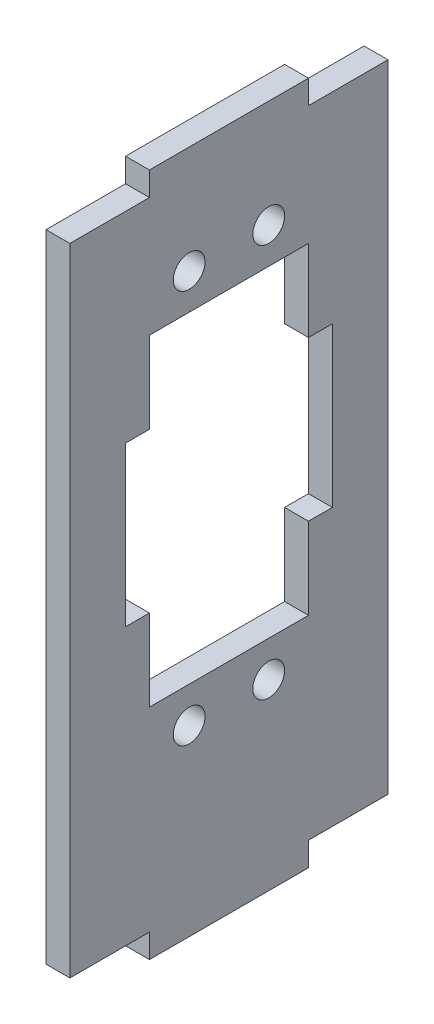
ISO-10303-21;
HEADER;
FILE_DESCRIPTION(('STEP AP214'),'2;1');
FILE_NAME('part.step','',(''),(''),'','','');
FILE_SCHEMA(('AUTOMOTIVE_DESIGN { 1 0 10303 214 1 1 1 1 }'));
ENDSEC;
DATA;
#1=APPLICATION_CONTEXT('core data for automotive mechanical design processes');
#2=APPLICATION_PROTOCOL_DEFINITION('international standard','automotive_design',2000,#1);
#3=PRODUCT_CONTEXT('',#1,'mechanical');
#4=PRODUCT('Part','Part','',(#3));
#5=PRODUCT_RELATED_PRODUCT_CATEGORY('part','',(#4));
#6=PRODUCT_DEFINITION_FORMATION('','',#4);
#7=PRODUCT_DEFINITION_CONTEXT('part definition',#1,'design');
#8=PRODUCT_DEFINITION('design','',#6,#7);
#9=PRODUCT_DEFINITION_SHAPE('','',#8);
#10=(LENGTH_UNIT() NAMED_UNIT(*) SI_UNIT(.MILLI.,.METRE.));
#11=(NAMED_UNIT(*) PLANE_ANGLE_UNIT() SI_UNIT($,.RADIAN.));
#12=(NAMED_UNIT(*) SI_UNIT($,.STERADIAN.) SOLID_ANGLE_UNIT());
#13=UNCERTAINTY_MEASURE_WITH_UNIT(LENGTH_MEASURE(1.E-05),#10,'distance_accuracy_value','');
#14=(GEOMETRIC_REPRESENTATION_CONTEXT(3) GLOBAL_UNCERTAINTY_ASSIGNED_CONTEXT((#13)) GLOBAL_UNIT_ASSIGNED_CONTEXT((#10,
#11,#12)) REPRESENTATION_CONTEXT('',''));
#15=CARTESIAN_POINT('',(0.,0.,0.));
#16=DIRECTION('',(0.,0.,1.));
#17=DIRECTION('',(1.,0.,0.));
#18=AXIS2_PLACEMENT_3D('',#15,#16,#17);
#19=CARTESIAN_POINT('',(3.,80.,30.));
#20=DIRECTION('',(0.,0.,1.));
#21=DIRECTION('',(1.,0.,0.));
#22=AXIS2_PLACEMENT_3D('',#19,#20,#21);
#23=PLANE('',#22);
#24=DIRECTION('',(0.,1.,0.));
#25=VECTOR('',#24,1.);
#26=CARTESIAN_POINT('',(0.,80.,30.));
#27=LINE('',#26,#25);
#28=CARTESIAN_POINT('',(0.,80.,30.));
#29=VERTEX_POINT('',#28);
#30=CARTESIAN_POINT('',(0.,83.,30.));
#31=VERTEX_POINT('',#30);
#32=EDGE_CURVE('E228',#29,#31,#27,.T.);
#33=ORIENTED_EDGE('',*,*,#32,.F.);
#34=DIRECTION('',(-1.,0.,0.));
#35=VECTOR('',#34,1.);
#36=CARTESIAN_POINT('',(3.,80.,30.));
#37=LINE('',#36,#35);
#38=CARTESIAN_POINT('',(3.,80.,30.));
#39=VERTEX_POINT('',#38);
#40=EDGE_CURVE('E349',#39,#29,#37,.T.);
#41=ORIENTED_EDGE('',*,*,#40,.F.);
#42=DIRECTION('',(0.,1.,0.));
#43=VECTOR('',#42,1.);
#44=CARTESIAN_POINT('',(3.,80.,30.));
#45=LINE('',#44,#43);
#46=CARTESIAN_POINT('',(3.00000000000001,83.,30.));
#47=VERTEX_POINT('',#46);
#48=EDGE_CURVE('E330',#39,#47,#45,.T.);
#49=ORIENTED_EDGE('',*,*,#48,.T.);
#50=DIRECTION('',(-1.,0.,0.));
#51=VECTOR('',#50,1.);
#52=CARTESIAN_POINT('',(3.00000000000001,83.,30.));
#53=LINE('',#52,#51);
#54=EDGE_CURVE('E10',#47,#31,#53,.T.);
#55=ORIENTED_EDGE('',*,*,#54,.T.);
#56=EDGE_LOOP('',(#33,#41,#49,#55));
#57=FACE_BOUND('',#56,.T.);
#58=ADVANCED_FACE('F16',(#57),#23,.T.);
#59=CARTESIAN_POINT('',(3.00000000000001,83.,30.));
#60=DIRECTION('',(0.,1.,0.));
#61=DIRECTION('',(0.,0.,1.));
#62=AXIS2_PLACEMENT_3D('',#59,#60,#61);
#63=PLANE('',#62);
#64=DIRECTION('',(0.,0.,-1.));
#65=VECTOR('',#64,1.);
#66=CARTESIAN_POINT('',(0.,83.,30.));
#67=LINE('',#66,#65);
#68=CARTESIAN_POINT('',(0.,83.,10.));
#69=VERTEX_POINT('',#68);
#70=EDGE_CURVE('E223',#31,#69,#67,.T.);
#71=ORIENTED_EDGE('',*,*,#70,.F.);
#72=ORIENTED_EDGE('',*,*,#54,.F.);
#73=DIRECTION('',(0.,0.,-1.));
#74=VECTOR('',#73,1.);
#75=CARTESIAN_POINT('',(3.00000000000001,83.,30.));
#76=LINE('',#75,#74);
#77=CARTESIAN_POINT('',(3.00000000000001,83.,10.));
#78=VERTEX_POINT('',#77);
#79=EDGE_CURVE('E371',#47,#78,#76,.T.);
#80=ORIENTED_EDGE('',*,*,#79,.T.);
#81=DIRECTION('',(-1.,0.,0.));
#82=VECTOR('',#81,1.);
#83=CARTESIAN_POINT('',(3.00000000000001,83.,10.));
#84=LINE('',#83,#82);
#85=EDGE_CURVE('E24',#78,#69,#84,.T.);
#86=ORIENTED_EDGE('',*,*,#85,.T.);
#87=EDGE_LOOP('',(#71,#72,#80,#86));
#88=FACE_BOUND('',#87,.T.);
#89=ADVANCED_FACE('F370',(#88),#63,.T.);
#90=CARTESIAN_POINT('',(3.00000000000001,83.,10.));
#91=DIRECTION('',(0.,0.,-1.));
#92=DIRECTION('',(-1.,0.,0.));
#93=AXIS2_PLACEMENT_3D('',#90,#91,#92);
#94=PLANE('',#93);
#95=DIRECTION('',(0.,-1.,0.));
#96=VECTOR('',#95,1.);
#97=CARTESIAN_POINT('',(0.,83.,10.));
#98=LINE('',#97,#96);
#99=CARTESIAN_POINT('',(0.,80.,10.));
#100=VERTEX_POINT('',#99);
#101=EDGE_CURVE('E227',#69,#100,#98,.T.);
#102=ORIENTED_EDGE('',*,*,#101,.F.);
#103=ORIENTED_EDGE('',*,*,#85,.F.);
#104=DIRECTION('',(0.,-1.,0.));
#105=VECTOR('',#104,1.);
#106=CARTESIAN_POINT('',(3.00000000000001,83.,10.));
#107=LINE('',#106,#105);
#108=CARTESIAN_POINT('',(3.,80.,10.));
#109=VERTEX_POINT('',#108);
#110=EDGE_CURVE('E388',#78,#109,#107,.T.);
#111=ORIENTED_EDGE('',*,*,#110,.T.);
#112=DIRECTION('',(-1.,0.,0.));
#113=VECTOR('',#112,1.);
#114=CARTESIAN_POINT('',(3.,80.,10.));
#115=LINE('',#114,#113);
#116=EDGE_CURVE('E368',#109,#100,#115,.T.);
#117=ORIENTED_EDGE('',*,*,#116,.T.);
#118=EDGE_LOOP('',(#102,#103,#111,#117));
#119=FACE_BOUND('',#118,.T.);
#120=ADVANCED_FACE('F375',(#119),#94,.T.);
#121=CARTESIAN_POINT('',(3.,80.,10.));
#122=DIRECTION('',(0.,1.,0.));
#123=DIRECTION('',(0.,0.,1.));
#124=AXIS2_PLACEMENT_3D('',#121,#122,#123);
#125=PLANE('',#124);
#126=DIRECTION('',(0.,0.,-1.));
#127=VECTOR('',#126,1.);
#128=CARTESIAN_POINT('',(0.,80.,10.));
#129=LINE('',#128,#127);
#130=CARTESIAN_POINT('',(0.,80.,0.));
#131=VERTEX_POINT('',#130);
#132=EDGE_CURVE('E232',#100,#131,#129,.T.);
#133=ORIENTED_EDGE('',*,*,#132,.F.);
#134=ORIENTED_EDGE('',*,*,#116,.F.);
#135=DIRECTION('',(0.,0.,-1.));
#136=VECTOR('',#135,1.);
#137=CARTESIAN_POINT('',(3.,80.,10.));
#138=LINE('',#137,#136);
#139=CARTESIAN_POINT('',(3.,80.,0.));
#140=VERTEX_POINT('',#139);
#141=EDGE_CURVE('E955',#109,#140,#138,.T.);
#142=ORIENTED_EDGE('',*,*,#141,.T.);
#143=DIRECTION('',(-1.,0.,0.));
#144=VECTOR('',#143,1.);
#145=CARTESIAN_POINT('',(3.,80.,0.));
#146=LINE('',#145,#144);
#147=EDGE_CURVE('E366',#140,#131,#146,.T.);
#148=ORIENTED_EDGE('',*,*,#147,.T.);
#149=EDGE_LOOP('',(#133,#134,#142,#148));
#150=FACE_BOUND('',#149,.T.);
#151=ADVANCED_FACE('F473',(#150),#125,.T.);
#152=CARTESIAN_POINT('',(3.,80.,0.));
#153=DIRECTION('',(0.,0.,-1.));
#154=DIRECTION('',(0.,1.,0.));
#155=AXIS2_PLACEMENT_3D('',#152,#153,#154);
#156=PLANE('',#155);
#157=DIRECTION('',(0.,-1.,0.));
#158=VECTOR('',#157,1.);
#159=CARTESIAN_POINT('',(0.,80.,0.));
#160=LINE('',#159,#158);
#161=CARTESIAN_POINT('',(0.,0.,0.));
#162=VERTEX_POINT('',#161);
#163=EDGE_CURVE('E236',#131,#162,#160,.T.);
#164=ORIENTED_EDGE('',*,*,#163,.F.);
#165=ORIENTED_EDGE('',*,*,#147,.F.);
#166=DIRECTION('',(0.,-1.,0.));
#167=VECTOR('',#166,1.);
#168=CARTESIAN_POINT('',(3.,80.,0.));
#169=LINE('',#168,#167);
#170=CARTESIAN_POINT('',(3.,0.,0.));
#171=VERTEX_POINT('',#170);
#172=EDGE_CURVE('E952',#140,#171,#169,.T.);
#173=ORIENTED_EDGE('',*,*,#172,.T.);
#174=DIRECTION('',(-1.,0.,0.));
#175=VECTOR('',#174,1.);
#176=CARTESIAN_POINT('',(3.,0.,0.));
#177=LINE('',#176,#175);
#178=EDGE_CURVE('E364',#171,#162,#177,.T.);
#179=ORIENTED_EDGE('',*,*,#178,.T.);
#180=EDGE_LOOP('',(#164,#165,#173,#179));
#181=FACE_BOUND('',#180,.T.);
#182=ADVANCED_FACE('F478',(#181),#156,.T.);
#183=CARTESIAN_POINT('',(3.,0.,0.));
#184=DIRECTION('',(0.,-1.,0.));
#185=DIRECTION('',(0.,0.,-1.));
#186=AXIS2_PLACEMENT_3D('',#183,#184,#185);
#187=PLANE('',#186);
#188=DIRECTION('',(0.,0.,1.));
#189=VECTOR('',#188,1.);
#190=CARTESIAN_POINT('',(0.,0.,0.));
#191=LINE('',#190,#189);
#192=CARTESIAN_POINT('',(0.,0.,9.99999999999999));
#193=VERTEX_POINT('',#192);
#194=EDGE_CURVE('E240',#162,#193,#191,.T.);
#195=ORIENTED_EDGE('',*,*,#194,.F.);
#196=ORIENTED_EDGE('',*,*,#178,.F.);
#197=DIRECTION('',(0.,0.,1.));
#198=VECTOR('',#197,1.);
#199=CARTESIAN_POINT('',(3.,0.,0.));
#200=LINE('',#199,#198);
#201=CARTESIAN_POINT('',(3.,0.,9.99999999999999));
#202=VERTEX_POINT('',#201);
#203=EDGE_CURVE('E949',#171,#202,#200,.T.);
#204=ORIENTED_EDGE('',*,*,#203,.T.);
#205=DIRECTION('',(-1.,0.,0.));
#206=VECTOR('',#205,1.);
#207=CARTESIAN_POINT('',(3.,0.,9.99999999999999));
#208=LINE('',#207,#206);
#209=EDGE_CURVE('E362',#202,#193,#208,.T.);
#210=ORIENTED_EDGE('',*,*,#209,.T.);
#211=EDGE_LOOP('',(#195,#196,#204,#210));
#212=FACE_BOUND('',#211,.T.);
#213=ADVANCED_FACE('F482',(#212),#187,.T.);
#214=CARTESIAN_POINT('',(3.,0.,9.99999999999999));
#215=DIRECTION('',(0.,0.,-1.));
#216=DIRECTION('',(-1.,0.,0.));
#217=AXIS2_PLACEMENT_3D('',#214,#215,#216);
#218=PLANE('',#217);
#219=DIRECTION('',(0.,-1.,0.));
#220=VECTOR('',#219,1.);
#221=CARTESIAN_POINT('',(0.,0.,9.99999999999999));
#222=LINE('',#221,#220);
#223=CARTESIAN_POINT('',(0.,-3.,9.99999999999999));
#224=VERTEX_POINT('',#223);
#225=EDGE_CURVE('E244',#193,#224,#222,.T.);
#226=ORIENTED_EDGE('',*,*,#225,.F.);
#227=ORIENTED_EDGE('',*,*,#209,.F.);
#228=DIRECTION('',(0.,-1.,0.));
#229=VECTOR('',#228,1.);
#230=CARTESIAN_POINT('',(3.,0.,9.99999999999999));
#231=LINE('',#230,#229);
#232=CARTESIAN_POINT('',(3.,-3.,9.99999999999999));
#233=VERTEX_POINT('',#232);
#234=EDGE_CURVE('E946',#202,#233,#231,.T.);
#235=ORIENTED_EDGE('',*,*,#234,.T.);
#236=DIRECTION('',(-1.,0.,0.));
#237=VECTOR('',#236,1.);
#238=CARTESIAN_POINT('',(3.,-3.,9.99999999999999));
#239=LINE('',#238,#237);
#240=EDGE_CURVE('E360',#233,#224,#239,.T.);
#241=ORIENTED_EDGE('',*,*,#240,.T.);
#242=EDGE_LOOP('',(#226,#227,#235,#241));
#243=FACE_BOUND('',#242,.T.);
#244=ADVANCED_FACE('F486',(#243),#218,.T.);
#245=CARTESIAN_POINT('',(3.,-3.,9.99999999999999));
#246=DIRECTION('',(0.,-1.,0.));
#247=DIRECTION('',(0.,0.,-1.));
#248=AXIS2_PLACEMENT_3D('',#245,#246,#247);
#249=PLANE('',#248);
#250=DIRECTION('',(0.,0.,1.));
#251=VECTOR('',#250,1.);
#252=CARTESIAN_POINT('',(0.,-3.,9.99999999999999));
#253=LINE('',#252,#251);
#254=CARTESIAN_POINT('',(0.,-3.,30.));
#255=VERTEX_POINT('',#254);
#256=EDGE_CURVE('E248',#224,#255,#253,.T.);
#257=ORIENTED_EDGE('',*,*,#256,.F.);
#258=ORIENTED_EDGE('',*,*,#240,.F.);
#259=DIRECTION('',(0.,0.,1.));
#260=VECTOR('',#259,1.);
#261=CARTESIAN_POINT('',(3.,-3.,9.99999999999999));
#262=LINE('',#261,#260);
#263=CARTESIAN_POINT('',(3.,-3.,30.));
#264=VERTEX_POINT('',#263);
#265=EDGE_CURVE('E943',#233,#264,#262,.T.);
#266=ORIENTED_EDGE('',*,*,#265,.T.);
#267=DIRECTION('',(-1.,0.,0.));
#268=VECTOR('',#267,1.);
#269=CARTESIAN_POINT('',(3.,-3.,30.));
#270=LINE('',#269,#268);
#271=EDGE_CURVE('E358',#264,#255,#270,.T.);
#272=ORIENTED_EDGE('',*,*,#271,.T.);
#273=EDGE_LOOP('',(#257,#258,#266,#272));
#274=FACE_BOUND('',#273,.T.);
#275=ADVANCED_FACE('F490',(#274),#249,.T.);
#276=CARTESIAN_POINT('',(3.,-3.,30.));
#277=DIRECTION('',(0.,0.,1.));
#278=DIRECTION('',(1.,0.,0.));
#279=AXIS2_PLACEMENT_3D('',#276,#277,#278);
#280=PLANE('',#279);
#281=DIRECTION('',(0.,1.,0.));
#282=VECTOR('',#281,1.);
#283=CARTESIAN_POINT('',(0.,-3.,30.));
#284=LINE('',#283,#282);
#285=CARTESIAN_POINT('',(0.,0.,30.));
#286=VERTEX_POINT('',#285);
#287=EDGE_CURVE('E252',#255,#286,#284,.T.);
#288=ORIENTED_EDGE('',*,*,#287,.F.);
#289=ORIENTED_EDGE('',*,*,#271,.F.);
#290=DIRECTION('',(0.,1.,0.));
#291=VECTOR('',#290,1.);
#292=CARTESIAN_POINT('',(3.,-3.,30.));
#293=LINE('',#292,#291);
#294=CARTESIAN_POINT('',(3.,0.,30.));
#295=VERTEX_POINT('',#294);
#296=EDGE_CURVE('E939',#264,#295,#293,.T.);
#297=ORIENTED_EDGE('',*,*,#296,.T.);
#298=DIRECTION('',(-1.,0.,0.));
#299=VECTOR('',#298,1.);
#300=CARTESIAN_POINT('',(3.,0.,30.));
#301=LINE('',#300,#299);
#302=EDGE_CURVE('E356',#295,#286,#301,.T.);
#303=ORIENTED_EDGE('',*,*,#302,.T.);
#304=EDGE_LOOP('',(#288,#289,#297,#303));
#305=FACE_BOUND('',#304,.T.);
#306=ADVANCED_FACE('F494',(#305),#280,.T.);
#307=CARTESIAN_POINT('',(3.,0.,40.));
#308=DIRECTION('',(0.,-1.,0.));
#309=DIRECTION('',(0.,0.,-1.));
#310=AXIS2_PLACEMENT_3D('',#307,#308,#309);
#311=PLANE('',#310);
#312=DIRECTION('',(0.,0.,1.));
#313=VECTOR('',#312,1.);
#314=CARTESIAN_POINT('',(0.,0.,40.));
#315=LINE('',#314,#313);
#316=CARTESIAN_POINT('',(0.,0.,40.));
#317=VERTEX_POINT('',#316);
#318=EDGE_CURVE('E256',#286,#317,#315,.T.);
#319=ORIENTED_EDGE('',*,*,#318,.F.);
#320=ORIENTED_EDGE('',*,*,#302,.F.);
#321=DIRECTION('',(0.,0.,1.));
#322=VECTOR('',#321,1.);
#323=CARTESIAN_POINT('',(3.,0.,40.));
#324=LINE('',#323,#322);
#325=CARTESIAN_POINT('',(3.,0.,40.));
#326=VERTEX_POINT('',#325);
#327=EDGE_CURVE('E935',#295,#326,#324,.T.);
#328=ORIENTED_EDGE('',*,*,#327,.T.);
#329=DIRECTION('',(-1.,0.,0.));
#330=VECTOR('',#329,1.);
#331=CARTESIAN_POINT('',(3.,0.,40.));
#332=LINE('',#331,#330);
#333=EDGE_CURVE('E354',#326,#317,#332,.T.);
#334=ORIENTED_EDGE('',*,*,#333,.T.);
#335=EDGE_LOOP('',(#319,#320,#328,#334));
#336=FACE_BOUND('',#335,.T.);
#337=ADVANCED_FACE('F498',(#336),#311,.T.);
#338=CARTESIAN_POINT('',(3.,80.,40.));
#339=DIRECTION('',(0.,0.,1.));
#340=DIRECTION('',(0.,-1.,0.));
#341=AXIS2_PLACEMENT_3D('',#338,#339,#340);
#342=PLANE('',#341);
#343=DIRECTION('',(0.,1.,0.));
#344=VECTOR('',#343,1.);
#345=CARTESIAN_POINT('',(0.,80.,40.));
#346=LINE('',#345,#344);
#347=CARTESIAN_POINT('',(0.,80.,40.));
#348=VERTEX_POINT('',#347);
#349=EDGE_CURVE('E260',#317,#348,#346,.T.);
#350=ORIENTED_EDGE('',*,*,#349,.F.);
#351=ORIENTED_EDGE('',*,*,#333,.F.);
#352=DIRECTION('',(0.,1.,0.));
#353=VECTOR('',#352,1.);
#354=CARTESIAN_POINT('',(3.,80.,40.));
#355=LINE('',#354,#353);
#356=CARTESIAN_POINT('',(3.,80.,40.));
#357=VERTEX_POINT('',#356);
#358=EDGE_CURVE('E938',#326,#357,#355,.T.);
#359=ORIENTED_EDGE('',*,*,#358,.T.);
#360=DIRECTION('',(-1.,0.,0.));
#361=VECTOR('',#360,1.);
#362=CARTESIAN_POINT('',(3.,80.,40.));
#363=LINE('',#362,#361);
#364=EDGE_CURVE('E352',#357,#348,#363,.T.);
#365=ORIENTED_EDGE('',*,*,#364,.T.);
#366=EDGE_LOOP('',(#350,#351,#359,#365));
#367=FACE_BOUND('',#366,.T.);
#368=ADVANCED_FACE('F502',(#367),#342,.T.);
#369=CARTESIAN_POINT('',(3.,54.75,30.));
#370=DIRECTION('',(0.,0.,1.));
#371=DIRECTION('',(0.,-1.,0.));
#372=AXIS2_PLACEMENT_3D('',#369,#370,#371);
#373=PLANE('',#372);
#374=DIRECTION('',(0.,1.,0.));
#375=VECTOR('',#374,1.);
#376=CARTESIAN_POINT('',(0.,54.75,30.));
#377=LINE('',#376,#375);
#378=CARTESIAN_POINT('',(0.,54.75,30.));
#379=VERTEX_POINT('',#378);
#380=CARTESIAN_POINT('',(0.,65.,30.));
#381=VERTEX_POINT('',#380);
#382=EDGE_CURVE('E311',#379,#381,#377,.T.);
#383=ORIENTED_EDGE('',*,*,#382,.T.);
#384=DIRECTION('',(-1.,0.,0.));
#385=VECTOR('',#384,1.);
#386=CARTESIAN_POINT('',(3.,65.,30.));
#387=LINE('',#386,#385);
#388=CARTESIAN_POINT('',(3.,65.,30.));
#389=VERTEX_POINT('',#388);
#390=EDGE_CURVE('E32',#389,#381,#387,.T.);
#391=ORIENTED_EDGE('',*,*,#390,.F.);
#392=DIRECTION('',(0.,1.,0.));
#393=VECTOR('',#392,1.);
#394=CARTESIAN_POINT('',(3.,54.75,30.));
#395=LINE('',#394,#393);
#396=CARTESIAN_POINT('',(3.,54.75,30.));
#397=VERTEX_POINT('',#396);
#398=EDGE_CURVE('E206',#397,#389,#395,.T.);
#399=ORIENTED_EDGE('',*,*,#398,.F.);
#400=DIRECTION('',(-1.,0.,0.));
#401=VECTOR('',#400,1.);
#402=CARTESIAN_POINT('',(3.,54.75,30.));
#403=LINE('',#402,#401);
#404=EDGE_CURVE('E347',#397,#379,#403,.T.);
#405=ORIENTED_EDGE('',*,*,#404,.T.);
#406=EDGE_LOOP('',(#383,#391,#399,#405));
#407=FACE_BOUND('',#406,.T.);
#408=ADVANCED_FACE('F446',(#407),#373,.F.);
#409=CARTESIAN_POINT('',(3.,54.75,33.));
#410=DIRECTION('',(0.,1.,0.));
#411=DIRECTION('',(0.,0.,1.));
#412=AXIS2_PLACEMENT_3D('',#409,#410,#411);
#413=PLANE('',#412);
#414=DIRECTION('',(0.,0.,-1.));
#415=VECTOR('',#414,1.);
#416=CARTESIAN_POINT('',(0.,54.75,33.));
#417=LINE('',#416,#415);
#418=CARTESIAN_POINT('',(0.,54.75,33.));
#419=VERTEX_POINT('',#418);
#420=EDGE_CURVE('E268',#419,#379,#417,.T.);
#421=ORIENTED_EDGE('',*,*,#420,.T.);
#422=ORIENTED_EDGE('',*,*,#404,.F.);
#423=DIRECTION('',(0.,0.,-1.));
#424=VECTOR('',#423,1.);
#425=CARTESIAN_POINT('',(3.,54.75,33.));
#426=LINE('',#425,#424);
#427=CARTESIAN_POINT('',(3.,54.75,33.));
#428=VERTEX_POINT('',#427);
#429=EDGE_CURVE('E394',#428,#397,#426,.T.);
#430=ORIENTED_EDGE('',*,*,#429,.F.);
#431=DIRECTION('',(-1.,0.,0.));
#432=VECTOR('',#431,1.);
#433=CARTESIAN_POINT('',(3.,54.75,33.));
#434=LINE('',#433,#432);
#435=EDGE_CURVE('E346',#428,#419,#434,.T.);
#436=ORIENTED_EDGE('',*,*,#435,.T.);
#437=EDGE_LOOP('',(#421,#422,#430,#436));
#438=FACE_BOUND('',#437,.T.);
#439=ADVANCED_FACE('F444',(#438),#413,.F.);
#440=CARTESIAN_POINT('',(3.,34.75,33.));
#441=DIRECTION('',(0.,0.,1.));
#442=DIRECTION('',(0.,-1.,0.));
#443=AXIS2_PLACEMENT_3D('',#440,#441,#442);
#444=PLANE('',#443);
#445=DIRECTION('',(0.,1.,0.));
#446=VECTOR('',#445,1.);
#447=CARTESIAN_POINT('',(0.,34.75,33.));
#448=LINE('',#447,#446);
#449=CARTESIAN_POINT('',(0.,34.75,33.));
#450=VERTEX_POINT('',#449);
#451=EDGE_CURVE('E275',#450,#419,#448,.T.);
#452=ORIENTED_EDGE('',*,*,#451,.T.);
#453=ORIENTED_EDGE('',*,*,#435,.F.);
#454=DIRECTION('',(0.,1.,0.));
#455=VECTOR('',#454,1.);
#456=CARTESIAN_POINT('',(3.,34.75,33.));
#457=LINE('',#456,#455);
#458=CARTESIAN_POINT('',(3.,34.75,33.));
#459=VERTEX_POINT('',#458);
#460=EDGE_CURVE('E397',#459,#428,#457,.T.);
#461=ORIENTED_EDGE('',*,*,#460,.F.);
#462=DIRECTION('',(-1.,0.,0.));
#463=VECTOR('',#462,1.);
#464=CARTESIAN_POINT('',(3.,34.75,33.));
#465=LINE('',#464,#463);
#466=EDGE_CURVE('E344',#459,#450,#465,.T.);
#467=ORIENTED_EDGE('',*,*,#466,.T.);
#468=EDGE_LOOP('',(#452,#453,#461,#467));
#469=FACE_BOUND('',#468,.T.);
#470=ADVANCED_FACE('F440',(#469),#444,.F.);
#471=CARTESIAN_POINT('',(3.,34.75,30.));
#472=DIRECTION('',(0.,-1.,0.));
#473=DIRECTION('',(0.,0.,-1.));
#474=AXIS2_PLACEMENT_3D('',#471,#472,#473);
#475=PLANE('',#474);
#476=DIRECTION('',(0.,0.,1.));
#477=VECTOR('',#476,1.);
#478=CARTESIAN_POINT('',(0.,34.75,30.));
#479=LINE('',#478,#477);
#480=CARTESIAN_POINT('',(0.,34.75,30.));
#481=VERTEX_POINT('',#480);
#482=EDGE_CURVE('E279',#481,#450,#479,.T.);
#483=ORIENTED_EDGE('',*,*,#482,.T.);
#484=ORIENTED_EDGE('',*,*,#466,.F.);
#485=DIRECTION('',(0.,0.,1.));
#486=VECTOR('',#485,1.);
#487=CARTESIAN_POINT('',(3.,34.75,30.));
#488=LINE('',#487,#486);
#489=CARTESIAN_POINT('',(3.,34.75,30.));
#490=VERTEX_POINT('',#489);
#491=EDGE_CURVE('E400',#490,#459,#488,.T.);
#492=ORIENTED_EDGE('',*,*,#491,.F.);
#493=DIRECTION('',(-1.,0.,0.));
#494=VECTOR('',#493,1.);
#495=CARTESIAN_POINT('',(3.,34.75,30.));
#496=LINE('',#495,#494);
#497=EDGE_CURVE('E342',#490,#481,#496,.T.);
#498=ORIENTED_EDGE('',*,*,#497,.T.);
#499=EDGE_LOOP('',(#483,#484,#492,#498));
#500=FACE_BOUND('',#499,.T.);
#501=ADVANCED_FACE('F436',(#500),#475,.F.);
#502=CARTESIAN_POINT('',(3.,24.5,29.9999999999999));
#503=DIRECTION('',(0.,0.,1.));
#504=DIRECTION('',(0.,-1.,0.));
#505=AXIS2_PLACEMENT_3D('',#502,#503,#504);
#506=PLANE('',#505);
#507=DIRECTION('',(0.,1.,0.));
#508=VECTOR('',#507,1.);
#509=CARTESIAN_POINT('',(0.,24.5,29.9999999999999));
#510=LINE('',#509,#508);
#511=CARTESIAN_POINT('',(0.,24.5,29.9999999999999));
#512=VERTEX_POINT('',#511);
#513=EDGE_CURVE('E283',#512,#481,#510,.T.);
#514=ORIENTED_EDGE('',*,*,#513,.T.);
#515=ORIENTED_EDGE('',*,*,#497,.F.);
#516=DIRECTION('',(0.,1.,0.));
#517=VECTOR('',#516,1.);
#518=CARTESIAN_POINT('',(3.,24.5,29.9999999999999));
#519=LINE('',#518,#517);
#520=CARTESIAN_POINT('',(3.,24.5,29.9999999999999));
#521=VERTEX_POINT('',#520);
#522=EDGE_CURVE('E403',#521,#490,#519,.T.);
#523=ORIENTED_EDGE('',*,*,#522,.F.);
#524=DIRECTION('',(-1.,0.,0.));
#525=VECTOR('',#524,1.);
#526=CARTESIAN_POINT('',(3.,24.5,29.9999999999999));
#527=LINE('',#526,#525);
#528=EDGE_CURVE('E340',#521,#512,#527,.T.);
#529=ORIENTED_EDGE('',*,*,#528,.T.);
#530=EDGE_LOOP('',(#514,#515,#523,#529));
#531=FACE_BOUND('',#530,.T.);
#532=ADVANCED_FACE('F432',(#531),#506,.F.);
#533=CARTESIAN_POINT('',(3.,24.5,9.99999999999999));
#534=DIRECTION('',(0.,-1.,0.));
#535=DIRECTION('',(0.,0.,-1.));
#536=AXIS2_PLACEMENT_3D('',#533,#534,#535);
#537=PLANE('',#536);
#538=DIRECTION('',(0.,0.,1.));
#539=VECTOR('',#538,1.);
#540=CARTESIAN_POINT('',(0.,24.5,9.99999999999999));
#541=LINE('',#540,#539);
#542=CARTESIAN_POINT('',(0.,24.5,9.99999999999999));
#543=VERTEX_POINT('',#542);
#544=EDGE_CURVE('E287',#543,#512,#541,.T.);
#545=ORIENTED_EDGE('',*,*,#544,.T.);
#546=ORIENTED_EDGE('',*,*,#528,.F.);
#547=DIRECTION('',(0.,0.,1.));
#548=VECTOR('',#547,1.);
#549=CARTESIAN_POINT('',(3.,24.5,9.99999999999999));
#550=LINE('',#549,#548);
#551=CARTESIAN_POINT('',(3.,24.5,9.99999999999999));
#552=VERTEX_POINT('',#551);
#553=EDGE_CURVE('E406',#552,#521,#550,.T.);
#554=ORIENTED_EDGE('',*,*,#553,.F.);
#555=DIRECTION('',(-1.,0.,0.));
#556=VECTOR('',#555,1.);
#557=CARTESIAN_POINT('',(3.,24.5,9.99999999999999));
#558=LINE('',#557,#556);
#559=EDGE_CURVE('E338',#552,#543,#558,.T.);
#560=ORIENTED_EDGE('',*,*,#559,.T.);
#561=EDGE_LOOP('',(#545,#546,#554,#560));
#562=FACE_BOUND('',#561,.T.);
#563=ADVANCED_FACE('F428',(#562),#537,.F.);
#564=CARTESIAN_POINT('',(3.,34.75,9.99999999999999));
#565=DIRECTION('',(0.,0.,-1.));
#566=DIRECTION('',(0.,1.,0.));
#567=AXIS2_PLACEMENT_3D('',#564,#565,#566);
#568=PLANE('',#567);
#569=DIRECTION('',(0.,-1.,0.));
#570=VECTOR('',#569,1.);
#571=CARTESIAN_POINT('',(0.,34.75,9.99999999999999));
#572=LINE('',#571,#570);
#573=CARTESIAN_POINT('',(0.,34.75,9.99999999999999));
#574=VERTEX_POINT('',#573);
#575=EDGE_CURVE('E291',#574,#543,#572,.T.);
#576=ORIENTED_EDGE('',*,*,#575,.T.);
#577=ORIENTED_EDGE('',*,*,#559,.F.);
#578=DIRECTION('',(0.,-1.,0.));
#579=VECTOR('',#578,1.);
#580=CARTESIAN_POINT('',(3.,34.75,9.99999999999999));
#581=LINE('',#580,#579);
#582=CARTESIAN_POINT('',(3.,34.75,9.99999999999999));
#583=VERTEX_POINT('',#582);
#584=EDGE_CURVE('E409',#583,#552,#581,.T.);
#585=ORIENTED_EDGE('',*,*,#584,.F.);
#586=DIRECTION('',(-1.,0.,0.));
#587=VECTOR('',#586,1.);
#588=CARTESIAN_POINT('',(3.,34.75,9.99999999999999));
#589=LINE('',#588,#587);
#590=EDGE_CURVE('E336',#583,#574,#589,.T.);
#591=ORIENTED_EDGE('',*,*,#590,.T.);
#592=EDGE_LOOP('',(#576,#577,#585,#591));
#593=FACE_BOUND('',#592,.T.);
#594=ADVANCED_FACE('F424',(#593),#568,.F.);
#595=CARTESIAN_POINT('',(3.,34.75,6.99999999999999));
#596=DIRECTION('',(0.,-1.,0.));
#597=DIRECTION('',(0.,0.,-1.));
#598=AXIS2_PLACEMENT_3D('',#595,#596,#597);
#599=PLANE('',#598);
#600=DIRECTION('',(0.,0.,1.));
#601=VECTOR('',#600,1.);
#602=CARTESIAN_POINT('',(0.,34.75,6.99999999999999));
#603=LINE('',#602,#601);
#604=CARTESIAN_POINT('',(0.,34.75,6.99999999999999));
#605=VERTEX_POINT('',#604);
#606=EDGE_CURVE('E295',#605,#574,#603,.T.);
#607=ORIENTED_EDGE('',*,*,#606,.T.);
#608=ORIENTED_EDGE('',*,*,#590,.F.);
#609=DIRECTION('',(0.,0.,1.));
#610=VECTOR('',#609,1.);
#611=CARTESIAN_POINT('',(3.,34.75,6.99999999999999));
#612=LINE('',#611,#610);
#613=CARTESIAN_POINT('',(3.,34.75,6.99999999999999));
#614=VERTEX_POINT('',#613);
#615=EDGE_CURVE('E412',#614,#583,#612,.T.);
#616=ORIENTED_EDGE('',*,*,#615,.F.);
#617=DIRECTION('',(-1.,0.,0.));
#618=VECTOR('',#617,1.);
#619=CARTESIAN_POINT('',(3.,34.75,6.99999999999999));
#620=LINE('',#619,#618);
#621=EDGE_CURVE('E334',#614,#605,#620,.T.);
#622=ORIENTED_EDGE('',*,*,#621,.T.);
#623=EDGE_LOOP('',(#607,#608,#616,#622));
#624=FACE_BOUND('',#623,.T.);
#625=ADVANCED_FACE('F420',(#624),#599,.F.);
#626=CARTESIAN_POINT('',(3.,54.75,7.));
#627=DIRECTION('',(0.,0.,-1.));
#628=DIRECTION('',(0.,1.,0.));
#629=AXIS2_PLACEMENT_3D('',#626,#627,#628);
#630=PLANE('',#629);
#631=DIRECTION('',(0.,-1.,0.));
#632=VECTOR('',#631,1.);
#633=CARTESIAN_POINT('',(0.,54.75,7.));
#634=LINE('',#633,#632);
#635=CARTESIAN_POINT('',(0.,54.75,7.));
#636=VERTEX_POINT('',#635);
#637=EDGE_CURVE('E299',#636,#605,#634,.T.);
#638=ORIENTED_EDGE('',*,*,#637,.T.);
#639=ORIENTED_EDGE('',*,*,#621,.F.);
#640=DIRECTION('',(0.,-1.,0.));
#641=VECTOR('',#640,1.);
#642=CARTESIAN_POINT('',(3.,54.75,7.));
#643=LINE('',#642,#641);
#644=CARTESIAN_POINT('',(3.,54.75,7.));
#645=VERTEX_POINT('',#644);
#646=EDGE_CURVE('E199',#645,#614,#643,.T.);
#647=ORIENTED_EDGE('',*,*,#646,.F.);
#648=DIRECTION('',(-1.,0.,0.));
#649=VECTOR('',#648,1.);
#650=CARTESIAN_POINT('',(3.,54.75,7.));
#651=LINE('',#650,#649);
#652=EDGE_CURVE('E191',#645,#636,#651,.T.);
#653=ORIENTED_EDGE('',*,*,#652,.T.);
#654=EDGE_LOOP('',(#638,#639,#647,#653));
#655=FACE_BOUND('',#654,.T.);
#656=ADVANCED_FACE('F416',(#655),#630,.F.);
#657=CARTESIAN_POINT('',(3.,54.75,10.));
#658=DIRECTION('',(0.,1.,0.));
#659=DIRECTION('',(0.,0.,1.));
#660=AXIS2_PLACEMENT_3D('',#657,#658,#659);
#661=PLANE('',#660);
#662=DIRECTION('',(0.,0.,-1.));
#663=VECTOR('',#662,1.);
#664=CARTESIAN_POINT('',(0.,54.75,10.));
#665=LINE('',#664,#663);
#666=CARTESIAN_POINT('',(0.,54.75,10.));
#667=VERTEX_POINT('',#666);
#668=EDGE_CURVE('E303',#667,#636,#665,.T.);
#669=ORIENTED_EDGE('',*,*,#668,.T.);
#670=ORIENTED_EDGE('',*,*,#652,.F.);
#671=DIRECTION('',(0.,0.,-1.));
#672=VECTOR('',#671,1.);
#673=CARTESIAN_POINT('',(3.,54.75,10.));
#674=LINE('',#673,#672);
#675=CARTESIAN_POINT('',(3.,54.75,10.));
#676=VERTEX_POINT('',#675);
#677=EDGE_CURVE('E194',#676,#645,#674,.T.);
#678=ORIENTED_EDGE('',*,*,#677,.F.);
#679=DIRECTION('',(-1.,0.,0.));
#680=VECTOR('',#679,1.);
#681=CARTESIAN_POINT('',(3.,54.75,10.));
#682=LINE('',#681,#680);
#683=EDGE_CURVE('E180',#676,#667,#682,.T.);
#684=ORIENTED_EDGE('',*,*,#683,.T.);
#685=EDGE_LOOP('',(#669,#670,#678,#684));
#686=FACE_BOUND('',#685,.T.);
#687=ADVANCED_FACE('F195',(#686),#661,.F.);
#688=CARTESIAN_POINT('',(3.,65.,10.));
#689=DIRECTION('',(0.,0.,-1.));
#690=DIRECTION('',(0.,1.,0.));
#691=AXIS2_PLACEMENT_3D('',#688,#689,#690);
#692=PLANE('',#691);
#693=DIRECTION('',(0.,-1.,0.));
#694=VECTOR('',#693,1.);
#695=CARTESIAN_POINT('',(0.,65.,10.));
#696=LINE('',#695,#694);
#697=CARTESIAN_POINT('',(0.,65.,9.99999999999999));
#698=VERTEX_POINT('',#697);
#699=EDGE_CURVE('E187',#698,#667,#696,.T.);
#700=ORIENTED_EDGE('',*,*,#699,.T.);
#701=ORIENTED_EDGE('',*,*,#683,.F.);
#702=DIRECTION('',(0.,-1.,0.));
#703=VECTOR('',#702,1.);
#704=CARTESIAN_POINT('',(3.,65.,10.));
#705=LINE('',#704,#703);
#706=CARTESIAN_POINT('',(3.,65.,9.99999999999999));
#707=VERTEX_POINT('',#706);
#708=EDGE_CURVE('E184',#707,#676,#705,.T.);
#709=ORIENTED_EDGE('',*,*,#708,.F.);
#710=DIRECTION('',(-1.,0.,0.));
#711=VECTOR('',#710,1.);
#712=CARTESIAN_POINT('',(3.,65.,9.99999999999999));
#713=LINE('',#712,#711);
#714=EDGE_CURVE('E108',#707,#698,#713,.T.);
#715=ORIENTED_EDGE('',*,*,#714,.T.);
#716=EDGE_LOOP('',(#700,#701,#709,#715));
#717=FACE_BOUND('',#716,.T.);
#718=ADVANCED_FACE('F182',(#717),#692,.F.);
#719=CARTESIAN_POINT('',(3.,69.5,15.));
#720=DIRECTION('',(-1.,0.,0.));
#721=DIRECTION('',(0.,0.,1.));
#722=AXIS2_PLACEMENT_3D('',#719,#720,#721);
#723=CYLINDRICAL_SURFACE('',#722,2.);
#724=CARTESIAN_POINT('',(3.,69.5,15.));
#725=DIRECTION('',(1.,0.,0.));
#726=DIRECTION('',(0.,1.,0.));
#727=AXIS2_PLACEMENT_3D('',#724,#725,#726);
#728=CIRCLE('',#727,2.);
#729=CARTESIAN_POINT('',(3.,71.5,15.));
#730=VERTEX_POINT('',#729);
#731=EDGE_CURVE('E214',#730,#730,#728,.T.);
#732=ORIENTED_EDGE('',*,*,#731,.T.);
#733=EDGE_LOOP('',(#732));
#734=FACE_BOUND('',#733,.T.);
#735=CARTESIAN_POINT('',(0.,69.5,15.));
#736=DIRECTION('',(1.,0.,0.));
#737=DIRECTION('',(0.,1.,0.));
#738=AXIS2_PLACEMENT_3D('',#735,#736,#737);
#739=CIRCLE('',#738,2.);
#740=CARTESIAN_POINT('',(0.,71.5,15.));
#741=VERTEX_POINT('',#740);
#742=EDGE_CURVE('E318',#741,#741,#739,.T.);
#743=ORIENTED_EDGE('',*,*,#742,.F.);
#744=EDGE_LOOP('',(#743));
#745=FACE_BOUND('',#744,.T.);
#746=ADVANCED_FACE('F461',(#734,#745),#723,.F.);
#747=CARTESIAN_POINT('',(3.,80.,30.));
#748=DIRECTION('',(0.,1.,0.));
#749=DIRECTION('',(0.,0.,1.));
#750=AXIS2_PLACEMENT_3D('',#747,#748,#749);
#751=PLANE('',#750);
#752=DIRECTION('',(0.,0.,-1.));
#753=VECTOR('',#752,1.);
#754=CARTESIAN_POINT('',(0.,80.,30.));
#755=LINE('',#754,#753);
#756=EDGE_CURVE('E264',#348,#29,#755,.T.);
#757=ORIENTED_EDGE('',*,*,#756,.F.);
#758=ORIENTED_EDGE('',*,*,#364,.F.);
#759=DIRECTION('',(0.,0.,-1.));
#760=VECTOR('',#759,1.);
#761=CARTESIAN_POINT('',(3.,80.,30.));
#762=LINE('',#761,#760);
#763=EDGE_CURVE('E392',#357,#39,#762,.T.);
#764=ORIENTED_EDGE('',*,*,#763,.T.);
#765=ORIENTED_EDGE('',*,*,#40,.T.);
#766=EDGE_LOOP('',(#757,#758,#764,#765));
#767=FACE_BOUND('',#766,.T.);
#768=ADVANCED_FACE('F451',(#767),#751,.T.);
#769=CARTESIAN_POINT('',(3.,65.,30.));
#770=DIRECTION('',(0.,1.,0.));
#771=DIRECTION('',(0.,0.,1.));
#772=AXIS2_PLACEMENT_3D('',#769,#770,#771);
#773=PLANE('',#772);
#774=DIRECTION('',(0.,0.,-1.));
#775=VECTOR('',#774,1.);
#776=CARTESIAN_POINT('',(0.,65.,30.));
#777=LINE('',#776,#775);
#778=EDGE_CURVE('E308',#381,#698,#777,.T.);
#779=ORIENTED_EDGE('',*,*,#778,.T.);
#780=ORIENTED_EDGE('',*,*,#714,.F.);
#781=DIRECTION('',(0.,0.,-1.));
#782=VECTOR('',#781,1.);
#783=CARTESIAN_POINT('',(3.,65.,30.));
#784=LINE('',#783,#782);
#785=EDGE_CURVE('E204',#389,#707,#784,.T.);
#786=ORIENTED_EDGE('',*,*,#785,.F.);
#787=ORIENTED_EDGE('',*,*,#390,.T.);
#788=EDGE_LOOP('',(#779,#780,#786,#787));
#789=FACE_BOUND('',#788,.T.);
#790=ADVANCED_FACE('F448',(#789),#773,.F.);
#791=CARTESIAN_POINT('',(3.,69.5,25.));
#792=DIRECTION('',(-1.,0.,0.));
#793=DIRECTION('',(0.,0.,1.));
#794=AXIS2_PLACEMENT_3D('',#791,#792,#793);
#795=CYLINDRICAL_SURFACE('',#794,2.);
#796=CARTESIAN_POINT('',(3.,69.5,25.));
#797=DIRECTION('',(1.,0.,0.));
#798=DIRECTION('',(0.,1.,0.));
#799=AXIS2_PLACEMENT_3D('',#796,#797,#798);
#800=CIRCLE('',#799,2.);
#801=CARTESIAN_POINT('',(3.,71.5,25.));
#802=VERTEX_POINT('',#801);
#803=EDGE_CURVE('E211',#802,#802,#800,.T.);
#804=ORIENTED_EDGE('',*,*,#803,.T.);
#805=EDGE_LOOP('',(#804));
#806=FACE_BOUND('',#805,.T.);
#807=CARTESIAN_POINT('',(0.,69.5,25.));
#808=DIRECTION('',(1.,0.,0.));
#809=DIRECTION('',(0.,1.,0.));
#810=AXIS2_PLACEMENT_3D('',#807,#808,#809);
#811=CIRCLE('',#810,2.);
#812=CARTESIAN_POINT('',(0.,71.5,25.));
#813=VERTEX_POINT('',#812);
#814=EDGE_CURVE('E314',#813,#813,#811,.T.);
#815=ORIENTED_EDGE('',*,*,#814,.F.);
#816=EDGE_LOOP('',(#815));
#817=FACE_BOUND('',#816,.T.);
#818=ADVANCED_FACE('F450',(#806,#817),#795,.F.);
#819=CARTESIAN_POINT('',(3.,20.,15.));
#820=DIRECTION('',(-1.,0.,0.));
#821=DIRECTION('',(0.,0.,1.));
#822=AXIS2_PLACEMENT_3D('',#819,#820,#821);
#823=CYLINDRICAL_SURFACE('',#822,2.);
#824=CARTESIAN_POINT('',(3.,20.,15.));
#825=DIRECTION('',(1.,0.,0.));
#826=DIRECTION('',(0.,1.,0.));
#827=AXIS2_PLACEMENT_3D('',#824,#825,#826);
#828=CIRCLE('',#827,2.);
#829=CARTESIAN_POINT('',(3.,22.,15.));
#830=VERTEX_POINT('',#829);
#831=EDGE_CURVE('E217',#830,#830,#828,.T.);
#832=ORIENTED_EDGE('',*,*,#831,.T.);
#833=EDGE_LOOP('',(#832));
#834=FACE_BOUND('',#833,.T.);
#835=CARTESIAN_POINT('',(0.,20.,15.));
#836=DIRECTION('',(1.,0.,0.));
#837=DIRECTION('',(0.,1.,0.));
#838=AXIS2_PLACEMENT_3D('',#835,#836,#837);
#839=CIRCLE('',#838,2.);
#840=CARTESIAN_POINT('',(0.,22.,15.));
#841=VERTEX_POINT('',#840);
#842=EDGE_CURVE('E322',#841,#841,#839,.T.);
#843=ORIENTED_EDGE('',*,*,#842,.F.);
#844=EDGE_LOOP('',(#843));
#845=FACE_BOUND('',#844,.T.);
#846=ADVANCED_FACE('F458',(#834,#845),#823,.F.);
#847=CARTESIAN_POINT('',(3.,20.,25.));
#848=DIRECTION('',(-1.,0.,0.));
#849=DIRECTION('',(0.,0.,1.));
#850=AXIS2_PLACEMENT_3D('',#847,#848,#849);
#851=CYLINDRICAL_SURFACE('',#850,2.);
#852=CARTESIAN_POINT('',(3.,20.,25.));
#853=DIRECTION('',(1.,0.,0.));
#854=DIRECTION('',(0.,1.,0.));
#855=AXIS2_PLACEMENT_3D('',#852,#853,#854);
#856=CIRCLE('',#855,2.);
#857=CARTESIAN_POINT('',(3.,22.,25.));
#858=VERTEX_POINT('',#857);
#859=EDGE_CURVE('E220',#858,#858,#856,.T.);
#860=ORIENTED_EDGE('',*,*,#859,.T.);
#861=EDGE_LOOP('',(#860));
#862=FACE_BOUND('',#861,.T.);
#863=CARTESIAN_POINT('',(0.,20.,25.));
#864=DIRECTION('',(1.,0.,0.));
#865=DIRECTION('',(0.,1.,0.));
#866=AXIS2_PLACEMENT_3D('',#863,#864,#865);
#867=CIRCLE('',#866,2.);
#868=CARTESIAN_POINT('',(0.,22.,25.));
#869=VERTEX_POINT('',#868);
#870=EDGE_CURVE('E326',#869,#869,#867,.T.);
#871=ORIENTED_EDGE('',*,*,#870,.F.);
#872=EDGE_LOOP('',(#871));
#873=FACE_BOUND('',#872,.T.);
#874=ADVANCED_FACE('F620',(#862,#873),#851,.F.);
#875=CARTESIAN_POINT('',(3.,0.,0.));
#876=DIRECTION('',(-1.,0.,0.));
#877=DIRECTION('',(0.,-1.,0.));
#878=AXIS2_PLACEMENT_3D('',#875,#876,#877);
#879=PLANE('',#878);
#880=ORIENTED_EDGE('',*,*,#831,.F.);
#881=EDGE_LOOP('',(#880));
#882=FACE_BOUND('',#881,.T.);
#883=ORIENTED_EDGE('',*,*,#803,.F.);
#884=EDGE_LOOP('',(#883));
#885=FACE_BOUND('',#884,.T.);
#886=ORIENTED_EDGE('',*,*,#398,.T.);
#887=ORIENTED_EDGE('',*,*,#785,.T.);
#888=ORIENTED_EDGE('',*,*,#708,.T.);
#889=ORIENTED_EDGE('',*,*,#677,.T.);
#890=ORIENTED_EDGE('',*,*,#646,.T.);
#891=ORIENTED_EDGE('',*,*,#615,.T.);
#892=ORIENTED_EDGE('',*,*,#584,.T.);
#893=ORIENTED_EDGE('',*,*,#553,.T.);
#894=ORIENTED_EDGE('',*,*,#522,.T.);
#895=ORIENTED_EDGE('',*,*,#491,.T.);
#896=ORIENTED_EDGE('',*,*,#460,.T.);
#897=ORIENTED_EDGE('',*,*,#429,.T.);
#898=EDGE_LOOP('',(#886,#887,#888,#889,#890,#891,#892,#893,#894,#895,#896,#897));
#899=FACE_BOUND('',#898,.T.);
#900=ORIENTED_EDGE('',*,*,#48,.F.);
#901=ORIENTED_EDGE('',*,*,#763,.F.);
#902=ORIENTED_EDGE('',*,*,#358,.F.);
#903=ORIENTED_EDGE('',*,*,#327,.F.);
#904=ORIENTED_EDGE('',*,*,#296,.F.);
#905=ORIENTED_EDGE('',*,*,#265,.F.);
#906=ORIENTED_EDGE('',*,*,#234,.F.);
#907=ORIENTED_EDGE('',*,*,#203,.F.);
#908=ORIENTED_EDGE('',*,*,#172,.F.);
#909=ORIENTED_EDGE('',*,*,#141,.F.);
#910=ORIENTED_EDGE('',*,*,#110,.F.);
#911=ORIENTED_EDGE('',*,*,#79,.F.);
#912=EDGE_LOOP('',(#900,#901,#902,#903,#904,#905,#906,#907,#908,#909,#910,#911));
#913=FACE_BOUND('',#912,.T.);
#914=ORIENTED_EDGE('',*,*,#731,.F.);
#915=EDGE_LOOP('',(#914));
#916=FACE_BOUND('',#915,.T.);
#917=ORIENTED_EDGE('',*,*,#859,.F.);
#918=EDGE_LOOP('',(#917));
#919=FACE_BOUND('',#918,.T.);
#920=ADVANCED_FACE('F202',(#882,#885,#899,#913,#916,#919),#879,.F.);
#921=CARTESIAN_POINT('',(0.,0.,0.));
#922=DIRECTION('',(-1.,0.,0.));
#923=DIRECTION('',(0.,-1.,0.));
#924=AXIS2_PLACEMENT_3D('',#921,#922,#923);
#925=PLANE('',#924);
#926=ORIENTED_EDGE('',*,*,#842,.T.);
#927=EDGE_LOOP('',(#926));
#928=FACE_BOUND('',#927,.T.);
#929=ORIENTED_EDGE('',*,*,#814,.T.);
#930=EDGE_LOOP('',(#929));
#931=FACE_BOUND('',#930,.T.);
#932=ORIENTED_EDGE('',*,*,#382,.F.);
#933=ORIENTED_EDGE('',*,*,#420,.F.);
#934=ORIENTED_EDGE('',*,*,#451,.F.);
#935=ORIENTED_EDGE('',*,*,#482,.F.);
#936=ORIENTED_EDGE('',*,*,#513,.F.);
#937=ORIENTED_EDGE('',*,*,#544,.F.);
#938=ORIENTED_EDGE('',*,*,#575,.F.);
#939=ORIENTED_EDGE('',*,*,#606,.F.);
#940=ORIENTED_EDGE('',*,*,#637,.F.);
#941=ORIENTED_EDGE('',*,*,#668,.F.);
#942=ORIENTED_EDGE('',*,*,#699,.F.);
#943=ORIENTED_EDGE('',*,*,#778,.F.);
#944=EDGE_LOOP('',(#932,#933,#934,#935,#936,#937,#938,#939,#940,#941,#942,#943));
#945=FACE_BOUND('',#944,.T.);
#946=ORIENTED_EDGE('',*,*,#32,.T.);
#947=ORIENTED_EDGE('',*,*,#70,.T.);
#948=ORIENTED_EDGE('',*,*,#101,.T.);
#949=ORIENTED_EDGE('',*,*,#132,.T.);
#950=ORIENTED_EDGE('',*,*,#163,.T.);
#951=ORIENTED_EDGE('',*,*,#194,.T.);
#952=ORIENTED_EDGE('',*,*,#225,.T.);
#953=ORIENTED_EDGE('',*,*,#256,.T.);
#954=ORIENTED_EDGE('',*,*,#287,.T.);
#955=ORIENTED_EDGE('',*,*,#318,.T.);
#956=ORIENTED_EDGE('',*,*,#349,.T.);
#957=ORIENTED_EDGE('',*,*,#756,.T.);
#958=EDGE_LOOP('',(#946,#947,#948,#949,#950,#951,#952,#953,#954,#955,#956,#957));
#959=FACE_BOUND('',#958,.T.);
#960=ORIENTED_EDGE('',*,*,#742,.T.);
#961=EDGE_LOOP('',(#960));
#962=FACE_BOUND('',#961,.T.);
#963=ORIENTED_EDGE('',*,*,#870,.T.);
#964=EDGE_LOOP('',(#963));
#965=FACE_BOUND('',#964,.T.);
#966=ADVANCED_FACE('F378',(#928,#931,#945,#959,#962,#965),#925,.T.);
#967=CLOSED_SHELL('',(#58,#89,#120,#151,#182,#213,#244,#275,#306,#337,#368,#408,#439,#470,#501,
#532,#563,#594,#625,#656,#687,#718,#746,#768,#790,#818,#846,#874,#920,#966));
#968=MANIFOLD_SOLID_BREP('B1',#967);
#969=ADVANCED_BREP_SHAPE_REPRESENTATION('',(#18,#968),#14);
#970=SHAPE_DEFINITION_REPRESENTATION(#9,#969);
ENDSEC;
END-ISO-10303-21;
